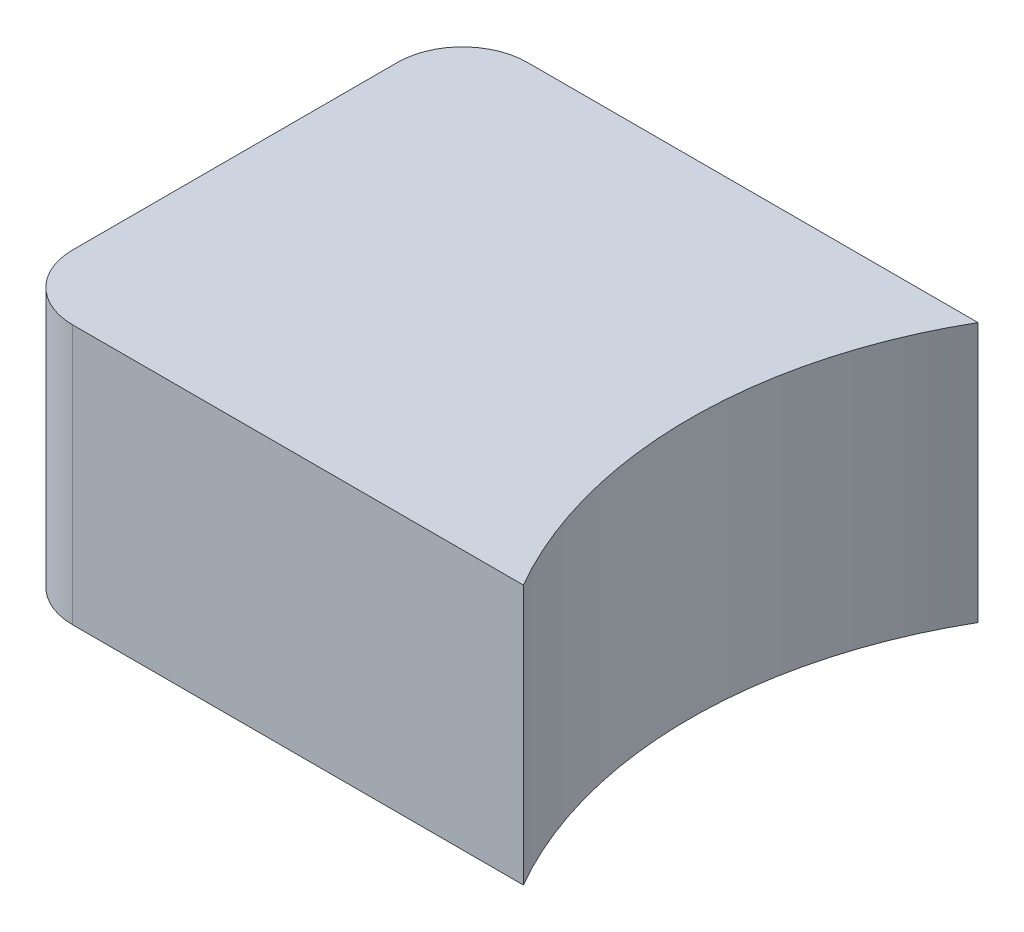
ISO-10303-21;
HEADER;
FILE_DESCRIPTION(('STEP AP214'),'2;1');
FILE_NAME('part.step','',(''),(''),'','','');
FILE_SCHEMA(('AUTOMOTIVE_DESIGN { 1 0 10303 214 1 1 1 1 }'));
ENDSEC;
DATA;
#1=APPLICATION_CONTEXT('core data for automotive mechanical design processes');
#2=APPLICATION_PROTOCOL_DEFINITION('international standard','automotive_design',2000,#1);
#3=PRODUCT_CONTEXT('',#1,'mechanical');
#4=PRODUCT('Part','Part','',(#3));
#5=PRODUCT_RELATED_PRODUCT_CATEGORY('part','',(#4));
#6=PRODUCT_DEFINITION_FORMATION('','',#4);
#7=PRODUCT_DEFINITION_CONTEXT('part definition',#1,'design');
#8=PRODUCT_DEFINITION('design','',#6,#7);
#9=PRODUCT_DEFINITION_SHAPE('','',#8);
#10=(LENGTH_UNIT() NAMED_UNIT(*) SI_UNIT(.MILLI.,.METRE.));
#11=(NAMED_UNIT(*) PLANE_ANGLE_UNIT() SI_UNIT($,.RADIAN.));
#12=(NAMED_UNIT(*) SI_UNIT($,.STERADIAN.) SOLID_ANGLE_UNIT());
#13=UNCERTAINTY_MEASURE_WITH_UNIT(LENGTH_MEASURE(1.E-05),#10,'distance_accuracy_value','');
#14=(GEOMETRIC_REPRESENTATION_CONTEXT(3) GLOBAL_UNCERTAINTY_ASSIGNED_CONTEXT((#13)) GLOBAL_UNIT_ASSIGNED_CONTEXT((#10,
#11,#12)) REPRESENTATION_CONTEXT('',''));
#15=CARTESIAN_POINT('',(0.,0.,0.));
#16=DIRECTION('',(0.,0.,1.));
#17=DIRECTION('',(1.,0.,0.));
#18=AXIS2_PLACEMENT_3D('',#15,#16,#17);
#19=CARTESIAN_POINT('',(0.,-6.,0.));
#20=DIRECTION('',(0.,-1.,0.));
#21=DIRECTION('',(0.,0.,1.));
#22=AXIS2_PLACEMENT_3D('',#19,#20,#21);
#23=CYLINDRICAL_SURFACE('',#22,7.);
#24=CARTESIAN_POINT('',(0.,-10.,0.));
#25=DIRECTION('',(0.,1.,0.));
#26=DIRECTION('',(0.,0.,-1.));
#27=AXIS2_PLACEMENT_3D('',#24,#25,#26);
#28=CIRCLE('',#27,7.);
#29=CARTESIAN_POINT('',(-6.06217782649107,-10.,-3.5));
#30=VERTEX_POINT('',#29);
#31=CARTESIAN_POINT('',(-6.06217782649107,-10.,3.5));
#32=VERTEX_POINT('',#31);
#33=EDGE_CURVE('E125',#30,#32,#28,.T.);
#34=ORIENTED_EDGE('',*,*,#33,.F.);
#35=DIRECTION('',(0.,-1.,0.));
#36=VECTOR('',#35,1.);
#37=CARTESIAN_POINT('',(-6.06217782649107,-6.,-3.5));
#38=LINE('',#37,#36);
#39=CARTESIAN_POINT('',(-6.06217782649107,-6.,-3.5));
#40=VERTEX_POINT('',#39);
#41=EDGE_CURVE('E111',#40,#30,#38,.T.);
#42=ORIENTED_EDGE('',*,*,#41,.F.);
#43=CARTESIAN_POINT('',(0.,-6.,0.));
#44=DIRECTION('',(0.,1.,0.));
#45=DIRECTION('',(0.,0.,-1.));
#46=AXIS2_PLACEMENT_3D('',#43,#44,#45);
#47=CIRCLE('',#46,7.);
#48=CARTESIAN_POINT('',(-6.06217782649107,-6.,3.5));
#49=VERTEX_POINT('',#48);
#50=EDGE_CURVE('E96',#40,#49,#47,.T.);
#51=ORIENTED_EDGE('',*,*,#50,.T.);
#52=DIRECTION('',(0.,-1.,0.));
#53=VECTOR('',#52,1.);
#54=CARTESIAN_POINT('',(-6.06217782649107,-6.,3.5));
#55=LINE('',#54,#53);
#56=EDGE_CURVE('E103',#49,#32,#55,.T.);
#57=ORIENTED_EDGE('',*,*,#56,.T.);
#58=EDGE_LOOP('',(#34,#42,#51,#57));
#59=FACE_BOUND('',#58,.T.);
#60=ADVANCED_FACE('F41',(#59),#23,.F.);
#61=CARTESIAN_POINT('',(-14.,-6.,3.5));
#62=DIRECTION('',(0.,0.,-1.));
#63=DIRECTION('',(1.,0.,0.));
#64=AXIS2_PLACEMENT_3D('',#61,#62,#63);
#65=PLANE('',#64);
#66=DIRECTION('',(-1.,0.,0.));
#67=VECTOR('',#66,1.);
#68=CARTESIAN_POINT('',(-14.,-10.,3.5));
#69=LINE('',#68,#67);
#70=CARTESIAN_POINT('',(-13.,-10.,3.5));
#71=VERTEX_POINT('',#70);
#72=EDGE_CURVE('E106',#32,#71,#69,.T.);
#73=ORIENTED_EDGE('',*,*,#72,.F.);
#74=ORIENTED_EDGE('',*,*,#56,.F.);
#75=DIRECTION('',(-1.,0.,0.));
#76=VECTOR('',#75,1.);
#77=CARTESIAN_POINT('',(-14.,-6.,3.5));
#78=LINE('',#77,#76);
#79=CARTESIAN_POINT('',(-13.,-6.,3.5));
#80=VERTEX_POINT('',#79);
#81=EDGE_CURVE('E92',#49,#80,#78,.T.);
#82=ORIENTED_EDGE('',*,*,#81,.T.);
#83=DIRECTION('',(0.,-1.,0.));
#84=VECTOR('',#83,1.);
#85=CARTESIAN_POINT('',(-13.,-6.,3.5));
#86=LINE('',#85,#84);
#87=EDGE_CURVE('E144',#71,#80,#86,.F.);
#88=ORIENTED_EDGE('',*,*,#87,.F.);
#89=EDGE_LOOP('',(#73,#74,#82,#88));
#90=FACE_BOUND('',#89,.T.);
#91=ADVANCED_FACE('F104',(#90),#65,.F.);
#92=CARTESIAN_POINT('',(-14.,-6.,-3.5));
#93=DIRECTION('',(1.,0.,0.));
#94=DIRECTION('',(0.,0.,1.));
#95=AXIS2_PLACEMENT_3D('',#92,#93,#94);
#96=PLANE('',#95);
#97=DIRECTION('',(0.,0.,-1.));
#98=VECTOR('',#97,1.);
#99=CARTESIAN_POINT('',(-14.,-10.,-3.5));
#100=LINE('',#99,#98);
#101=CARTESIAN_POINT('',(-14.,-10.,2.5));
#102=VERTEX_POINT('',#101);
#103=CARTESIAN_POINT('',(-14.,-10.,-2.5));
#104=VERTEX_POINT('',#103);
#105=EDGE_CURVE('E116',#102,#104,#100,.T.);
#106=ORIENTED_EDGE('',*,*,#105,.F.);
#107=DIRECTION('',(0.,-1.,0.));
#108=VECTOR('',#107,1.);
#109=CARTESIAN_POINT('',(-14.,-6.,2.5));
#110=LINE('',#109,#108);
#111=CARTESIAN_POINT('',(-14.,-6.,2.5));
#112=VERTEX_POINT('',#111);
#113=EDGE_CURVE('E137',#112,#102,#110,.T.);
#114=ORIENTED_EDGE('',*,*,#113,.F.);
#115=DIRECTION('',(0.,0.,-1.));
#116=VECTOR('',#115,1.);
#117=CARTESIAN_POINT('',(-14.,-6.,-3.5));
#118=LINE('',#117,#116);
#119=CARTESIAN_POINT('',(-14.,-6.,-2.5));
#120=VERTEX_POINT('',#119);
#121=EDGE_CURVE('E100',#112,#120,#118,.T.);
#122=ORIENTED_EDGE('',*,*,#121,.T.);
#123=DIRECTION('',(0.,-1.,0.));
#124=VECTOR('',#123,1.);
#125=CARTESIAN_POINT('',(-14.,-6.,-2.5));
#126=LINE('',#125,#124);
#127=EDGE_CURVE('E140',#104,#120,#126,.F.);
#128=ORIENTED_EDGE('',*,*,#127,.F.);
#129=EDGE_LOOP('',(#106,#114,#122,#128));
#130=FACE_BOUND('',#129,.T.);
#131=ADVANCED_FACE('F169',(#130),#96,.F.);
#132=CARTESIAN_POINT('',(-14.,-6.,-3.5));
#133=DIRECTION('',(0.,0.,1.));
#134=DIRECTION('',(-1.,0.,0.));
#135=AXIS2_PLACEMENT_3D('',#132,#133,#134);
#136=PLANE('',#135);
#137=DIRECTION('',(1.,0.,0.));
#138=VECTOR('',#137,1.);
#139=CARTESIAN_POINT('',(-14.,-6.,-3.5));
#140=LINE('',#139,#138);
#141=CARTESIAN_POINT('',(-13.,-6.,-3.5));
#142=VERTEX_POINT('',#141);
#143=EDGE_CURVE('E123',#142,#40,#140,.T.);
#144=ORIENTED_EDGE('',*,*,#143,.T.);
#145=ORIENTED_EDGE('',*,*,#41,.T.);
#146=DIRECTION('',(1.,0.,0.));
#147=VECTOR('',#146,1.);
#148=CARTESIAN_POINT('',(-14.,-10.,-3.5));
#149=LINE('',#148,#147);
#150=CARTESIAN_POINT('',(-13.,-10.,-3.5));
#151=VERTEX_POINT('',#150);
#152=EDGE_CURVE('E114',#151,#30,#149,.T.);
#153=ORIENTED_EDGE('',*,*,#152,.F.);
#154=DIRECTION('',(0.,-1.,0.));
#155=VECTOR('',#154,1.);
#156=CARTESIAN_POINT('',(-13.,-6.,-3.5));
#157=LINE('',#156,#155);
#158=EDGE_CURVE('E110',#142,#151,#157,.T.);
#159=ORIENTED_EDGE('',*,*,#158,.F.);
#160=EDGE_LOOP('',(#144,#145,#153,#159));
#161=FACE_BOUND('',#160,.T.);
#162=ADVANCED_FACE('F189',(#161),#136,.F.);
#163=CARTESIAN_POINT('',(0.,-6.,0.));
#164=DIRECTION('',(0.,1.,0.));
#165=DIRECTION('',(0.,0.,-1.));
#166=AXIS2_PLACEMENT_3D('',#163,#164,#165);
#167=PLANE('',#166);
#168=ORIENTED_EDGE('',*,*,#121,.F.);
#169=CARTESIAN_POINT('',(-13.,-6.,2.5));
#170=DIRECTION('',(0.,-1.,0.));
#171=DIRECTION('',(0.,0.,-1.));
#172=AXIS2_PLACEMENT_3D('',#169,#170,#171);
#173=CIRCLE('',#172,1.);
#174=EDGE_CURVE('E56',#80,#112,#173,.T.);
#175=ORIENTED_EDGE('',*,*,#174,.F.);
#176=ORIENTED_EDGE('',*,*,#81,.F.);
#177=ORIENTED_EDGE('',*,*,#50,.F.);
#178=ORIENTED_EDGE('',*,*,#143,.F.);
#179=CARTESIAN_POINT('',(-13.,-6.,-2.5));
#180=DIRECTION('',(0.,-1.,0.));
#181=DIRECTION('',(0.,0.,-1.));
#182=AXIS2_PLACEMENT_3D('',#179,#180,#181);
#183=CIRCLE('',#182,1.);
#184=EDGE_CURVE('E62',#120,#142,#183,.T.);
#185=ORIENTED_EDGE('',*,*,#184,.F.);
#186=EDGE_LOOP('',(#168,#175,#176,#177,#178,#185));
#187=FACE_BOUND('',#186,.T.);
#188=ADVANCED_FACE('F94',(#187),#167,.T.);
#189=CARTESIAN_POINT('',(0.,-10.,0.));
#190=DIRECTION('',(0.,1.,0.));
#191=DIRECTION('',(0.,0.,-1.));
#192=AXIS2_PLACEMENT_3D('',#189,#190,#191);
#193=PLANE('',#192);
#194=CARTESIAN_POINT('',(-10.5,-10.,0.));
#195=DIRECTION('',(0.,-1.,0.));
#196=DIRECTION('',(0.,0.,-1.));
#197=AXIS2_PLACEMENT_3D('',#194,#195,#196);
#198=CIRCLE('',#197,3.3);
#199=CARTESIAN_POINT('',(-10.5,-10.,-3.3));
#200=VERTEX_POINT('',#199);
#201=EDGE_CURVE('E11',#200,#200,#198,.T.);
#202=ORIENTED_EDGE('',*,*,#201,.F.);
#203=EDGE_LOOP('',(#202));
#204=FACE_BOUND('',#203,.T.);
#205=ORIENTED_EDGE('',*,*,#152,.T.);
#206=ORIENTED_EDGE('',*,*,#33,.T.);
#207=ORIENTED_EDGE('',*,*,#72,.T.);
#208=CARTESIAN_POINT('',(-13.,-10.,2.5));
#209=DIRECTION('',(0.,-1.,0.));
#210=DIRECTION('',(0.,0.,-1.));
#211=AXIS2_PLACEMENT_3D('',#208,#209,#210);
#212=CIRCLE('',#211,1.);
#213=EDGE_CURVE('E133',#102,#71,#212,.F.);
#214=ORIENTED_EDGE('',*,*,#213,.F.);
#215=ORIENTED_EDGE('',*,*,#105,.T.);
#216=CARTESIAN_POINT('',(-13.,-10.,-2.5));
#217=DIRECTION('',(0.,-1.,0.));
#218=DIRECTION('',(0.,0.,-1.));
#219=AXIS2_PLACEMENT_3D('',#216,#217,#218);
#220=CIRCLE('',#219,1.);
#221=EDGE_CURVE('E135',#151,#104,#220,.F.);
#222=ORIENTED_EDGE('',*,*,#221,.F.);
#223=EDGE_LOOP('',(#205,#206,#207,#214,#215,#222));
#224=FACE_BOUND('',#223,.T.);
#225=ADVANCED_FACE('F175',(#204,#224),#193,.F.);
#226=CARTESIAN_POINT('',(-13.,-6.,-2.5));
#227=DIRECTION('',(0.,-1.,0.));
#228=DIRECTION('',(0.,0.,1.));
#229=AXIS2_PLACEMENT_3D('',#226,#227,#228);
#230=CYLINDRICAL_SURFACE('',#229,1.);
#231=ORIENTED_EDGE('',*,*,#184,.T.);
#232=ORIENTED_EDGE('',*,*,#158,.T.);
#233=ORIENTED_EDGE('',*,*,#221,.T.);
#234=ORIENTED_EDGE('',*,*,#127,.T.);
#235=EDGE_LOOP('',(#231,#232,#233,#234));
#236=FACE_BOUND('',#235,.T.);
#237=ADVANCED_FACE('F173',(#236),#230,.T.);
#238=CARTESIAN_POINT('',(-13.,-6.,2.5));
#239=DIRECTION('',(0.,-1.,0.));
#240=DIRECTION('',(0.,0.,1.));
#241=AXIS2_PLACEMENT_3D('',#238,#239,#240);
#242=CYLINDRICAL_SURFACE('',#241,1.);
#243=ORIENTED_EDGE('',*,*,#174,.T.);
#244=ORIENTED_EDGE('',*,*,#113,.T.);
#245=ORIENTED_EDGE('',*,*,#213,.T.);
#246=ORIENTED_EDGE('',*,*,#87,.T.);
#247=EDGE_LOOP('',(#243,#244,#245,#246));
#248=FACE_BOUND('',#247,.T.);
#249=ADVANCED_FACE('F153',(#248),#242,.T.);
#250=CARTESIAN_POINT('',(-10.5,-8.5,0.));
#251=DIRECTION('',(0.,-1.,0.));
#252=DIRECTION('',(0.,0.,1.));
#253=AXIS2_PLACEMENT_3D('',#250,#251,#252);
#254=CYLINDRICAL_SURFACE('',#253,3.);
#255=CARTESIAN_POINT('',(-10.5,-9.7,0.));
#256=DIRECTION('',(0.,-1.,0.));
#257=DIRECTION('',(0.,0.,-1.));
#258=AXIS2_PLACEMENT_3D('',#255,#256,#257);
#259=CIRCLE('',#258,3.);
#260=CARTESIAN_POINT('',(-10.5,-9.7,-3.));
#261=VERTEX_POINT('',#260);
#262=EDGE_CURVE('E49',#261,#261,#259,.F.);
#263=ORIENTED_EDGE('',*,*,#262,.F.);
#264=EDGE_LOOP('',(#263));
#265=FACE_BOUND('',#264,.T.);
#266=CARTESIAN_POINT('',(-10.5,-8.5,0.));
#267=DIRECTION('',(0.,1.,0.));
#268=DIRECTION('',(0.,0.,1.));
#269=AXIS2_PLACEMENT_3D('',#266,#267,#268);
#270=CIRCLE('',#269,3.);
#271=CARTESIAN_POINT('',(-10.5,-8.5,3.));
#272=VERTEX_POINT('',#271);
#273=EDGE_CURVE('E119',#272,#272,#270,.T.);
#274=ORIENTED_EDGE('',*,*,#273,.T.);
#275=EDGE_LOOP('',(#274));
#276=FACE_BOUND('',#275,.T.);
#277=ADVANCED_FACE('F149',(#265,#276),#254,.F.);
#278=CARTESIAN_POINT('',(-10.5,-8.5,0.));
#279=DIRECTION('',(0.,-1.,0.));
#280=DIRECTION('',(0.,0.,1.));
#281=AXIS2_PLACEMENT_3D('',#278,#279,#280);
#282=PLANE('',#281);
#283=ORIENTED_EDGE('',*,*,#273,.F.);
#284=EDGE_LOOP('',(#283));
#285=FACE_BOUND('',#284,.T.);
#286=ADVANCED_FACE('F152',(#285),#282,.T.);
#287=CARTESIAN_POINT('',(-10.5,-9.7,0.));
#288=DIRECTION('',(0.,-1.,0.));
#289=DIRECTION('',(0.,0.,1.));
#290=AXIS2_PLACEMENT_3D('',#287,#288,#289);
#291=CONICAL_SURFACE('',#290,3.,0.785398163397455);
#292=ORIENTED_EDGE('',*,*,#201,.T.);
#293=EDGE_LOOP('',(#292));
#294=FACE_BOUND('',#293,.T.);
#295=ORIENTED_EDGE('',*,*,#262,.T.);
#296=EDGE_LOOP('',(#295));
#297=FACE_BOUND('',#296,.T.);
#298=ADVANCED_FACE('F43',(#294,#297),#291,.F.);
#299=CLOSED_SHELL('',(#60,#91,#131,#162,#188,#225,#237,#249,#277,#286,#298));
#300=MANIFOLD_SOLID_BREP('B2',#299);
#301=ADVANCED_BREP_SHAPE_REPRESENTATION('',(#18,#300),#14);
#302=SHAPE_DEFINITION_REPRESENTATION(#9,#301);
ENDSEC;
END-ISO-10303-21;
